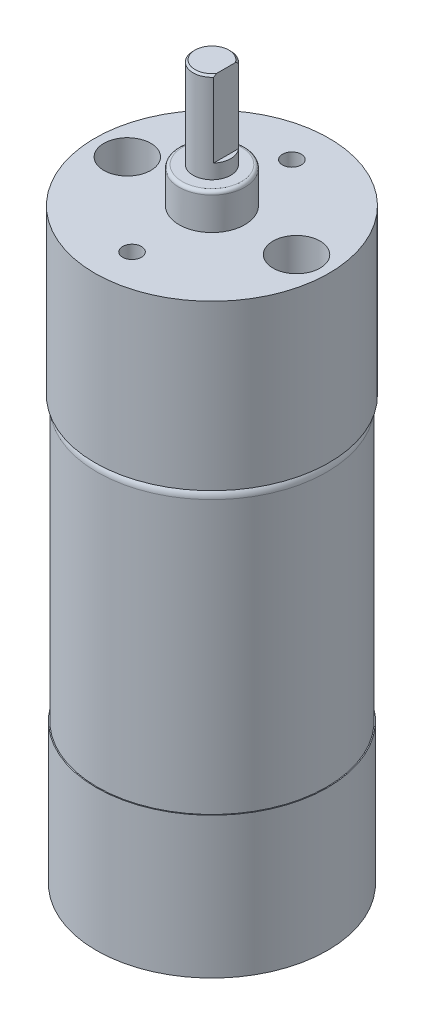
ISO-10303-21;
HEADER;
FILE_DESCRIPTION(('STEP AP214'),'2;1');
FILE_NAME('part.step','',(''),(''),'','','');
FILE_SCHEMA(('AUTOMOTIVE_DESIGN { 1 0 10303 214 1 1 1 1 }'));
ENDSEC;
DATA;
#1=APPLICATION_CONTEXT('core data for automotive mechanical design processes');
#2=APPLICATION_PROTOCOL_DEFINITION('international standard','automotive_design',2000,#1);
#3=PRODUCT_CONTEXT('',#1,'mechanical');
#4=PRODUCT('Part','Part','',(#3));
#5=PRODUCT_RELATED_PRODUCT_CATEGORY('part','',(#4));
#6=PRODUCT_DEFINITION_FORMATION('','',#4);
#7=PRODUCT_DEFINITION_CONTEXT('part definition',#1,'design');
#8=PRODUCT_DEFINITION('design','',#6,#7);
#9=PRODUCT_DEFINITION_SHAPE('','',#8);
#10=(LENGTH_UNIT() NAMED_UNIT(*) SI_UNIT(.MILLI.,.METRE.));
#11=(NAMED_UNIT(*) PLANE_ANGLE_UNIT() SI_UNIT($,.RADIAN.));
#12=(NAMED_UNIT(*) SI_UNIT($,.STERADIAN.) SOLID_ANGLE_UNIT());
#13=UNCERTAINTY_MEASURE_WITH_UNIT(LENGTH_MEASURE(1.E-05),#10,'distance_accuracy_value','');
#14=(GEOMETRIC_REPRESENTATION_CONTEXT(3) GLOBAL_UNCERTAINTY_ASSIGNED_CONTEXT((#13)) GLOBAL_UNIT_ASSIGNED_CONTEXT((#10,
#11,#12)) REPRESENTATION_CONTEXT('',''));
#15=CARTESIAN_POINT('',(0.,0.,0.));
#16=DIRECTION('',(0.,0.,1.));
#17=DIRECTION('',(1.,0.,0.));
#18=AXIS2_PLACEMENT_3D('',#15,#16,#17);
#19=CARTESIAN_POINT('',(0.,45.,0.));
#20=DIRECTION('',(0.,-1.,0.));
#21=DIRECTION('',(0.,0.,-1.));
#22=AXIS2_PLACEMENT_3D('',#19,#20,#21);
#23=CYLINDRICAL_SURFACE('',#22,12.2);
#24=CARTESIAN_POINT('',(0.,44.,0.));
#25=DIRECTION('',(0.,1.,0.));
#26=DIRECTION('',(0.,0.,1.));
#27=AXIS2_PLACEMENT_3D('',#24,#25,#26);
#28=CIRCLE('',#27,12.2);
#29=CARTESIAN_POINT('',(0.,44.,12.2));
#30=VERTEX_POINT('',#29);
#31=EDGE_CURVE('E150',#30,#30,#28,.F.);
#32=ORIENTED_EDGE('',*,*,#31,.T.);
#33=EDGE_LOOP('',(#32));
#34=FACE_BOUND('',#33,.T.);
#35=CARTESIAN_POINT('',(0.,15.,0.));
#36=DIRECTION('',(0.,1.,0.));
#37=DIRECTION('',(0.,0.,1.));
#38=AXIS2_PLACEMENT_3D('',#35,#36,#37);
#39=CIRCLE('',#38,12.2);
#40=CARTESIAN_POINT('',(0.,15.,12.2));
#41=VERTEX_POINT('',#40);
#42=EDGE_CURVE('E142',#41,#41,#39,.T.);
#43=ORIENTED_EDGE('',*,*,#42,.T.);
#44=EDGE_LOOP('',(#43));
#45=FACE_BOUND('',#44,.T.);
#46=ADVANCED_FACE('F49',(#34,#45),#23,.T.);
#47=CARTESIAN_POINT('',(0.,15.,0.));
#48=DIRECTION('',(0.,1.,0.));
#49=DIRECTION('',(0.,0.,1.));
#50=AXIS2_PLACEMENT_3D('',#47,#48,#49);
#51=PLANE('',#50);
#52=ORIENTED_EDGE('',*,*,#42,.F.);
#53=EDGE_LOOP('',(#52));
#54=FACE_BOUND('',#53,.T.);
#55=ADVANCED_FACE('F172',(#54),#51,.F.);
#56=CARTESIAN_POINT('',(0.,44.,0.));
#57=DIRECTION('',(0.,1.,0.));
#58=DIRECTION('',(0.,0.,1.));
#59=AXIS2_PLACEMENT_3D('',#56,#57,#58);
#60=TOROIDAL_SURFACE('',#59,11.2,1.);
#61=ORIENTED_EDGE('',*,*,#31,.F.);
#62=EDGE_LOOP('',(#61));
#63=FACE_BOUND('',#62,.T.);
#64=CARTESIAN_POINT('',(0.,45.,0.));
#65=DIRECTION('',(0.,1.,0.));
#66=DIRECTION('',(0.,0.,1.));
#67=AXIS2_PLACEMENT_3D('',#64,#65,#66);
#68=CIRCLE('',#67,11.2);
#69=CARTESIAN_POINT('',(0.,45.,11.2));
#70=VERTEX_POINT('',#69);
#71=EDGE_CURVE('E147',#70,#70,#68,.T.);
#72=ORIENTED_EDGE('',*,*,#71,.F.);
#73=EDGE_LOOP('',(#72));
#74=FACE_BOUND('',#73,.T.);
#75=ADVANCED_FACE('F178',(#63,#74),#60,.T.);
#76=CARTESIAN_POINT('',(0.,62.45,0.));
#77=DIRECTION('',(0.,-1.,0.));
#78=DIRECTION('',(0.,0.,-1.));
#79=AXIS2_PLACEMENT_3D('',#76,#77,#78);
#80=CYLINDRICAL_SURFACE('',#79,12.45);
#81=CARTESIAN_POINT('',(0.,62.45,0.));
#82=DIRECTION('',(0.,1.,0.));
#83=DIRECTION('',(0.,0.,1.));
#84=AXIS2_PLACEMENT_3D('',#81,#82,#83);
#85=CIRCLE('',#84,12.45);
#86=CARTESIAN_POINT('',(0.,62.45,12.45));
#87=VERTEX_POINT('',#86);
#88=EDGE_CURVE('E139',#87,#87,#85,.T.);
#89=ORIENTED_EDGE('',*,*,#88,.F.);
#90=EDGE_LOOP('',(#89));
#91=FACE_BOUND('',#90,.T.);
#92=CARTESIAN_POINT('',(0.,45.,0.));
#93=DIRECTION('',(0.,1.,0.));
#94=DIRECTION('',(0.,0.,1.));
#95=AXIS2_PLACEMENT_3D('',#92,#93,#94);
#96=CIRCLE('',#95,12.45);
#97=CARTESIAN_POINT('',(0.,45.,12.45));
#98=VERTEX_POINT('',#97);
#99=EDGE_CURVE('E118',#98,#98,#96,.T.);
#100=ORIENTED_EDGE('',*,*,#99,.T.);
#101=EDGE_LOOP('',(#100));
#102=FACE_BOUND('',#101,.T.);
#103=ADVANCED_FACE('F185',(#91,#102),#80,.T.);
#104=CARTESIAN_POINT('',(0.,62.45,0.));
#105=DIRECTION('',(0.,1.,0.));
#106=DIRECTION('',(0.,0.,1.));
#107=AXIS2_PLACEMENT_3D('',#104,#105,#106);
#108=PLANE('',#107);
#109=CARTESIAN_POINT('',(0.,62.45,0.));
#110=DIRECTION('',(0.,1.,0.));
#111=DIRECTION('',(0.,0.,1.));
#112=AXIS2_PLACEMENT_3D('',#109,#110,#111);
#113=CIRCLE('',#112,3.5);
#114=CARTESIAN_POINT('',(0.,62.45,-3.5));
#115=VERTEX_POINT('',#114);
#116=EDGE_CURVE('E111',#115,#115,#113,.T.);
#117=ORIENTED_EDGE('',*,*,#116,.F.);
#118=EDGE_LOOP('',(#117));
#119=FACE_BOUND('',#118,.T.);
#120=CARTESIAN_POINT('',(0.,62.45,-8.5));
#121=DIRECTION('',(0.,1.,0.));
#122=DIRECTION('',(0.,0.,1.));
#123=AXIS2_PLACEMENT_3D('',#120,#121,#122);
#124=CIRCLE('',#123,1.);
#125=CARTESIAN_POINT('',(0.,62.45,-7.5));
#126=VERTEX_POINT('',#125);
#127=EDGE_CURVE('E119',#126,#126,#124,.T.);
#128=ORIENTED_EDGE('',*,*,#127,.F.);
#129=EDGE_LOOP('',(#128));
#130=FACE_BOUND('',#129,.T.);
#131=CARTESIAN_POINT('',(0.,62.45,8.5));
#132=DIRECTION('',(0.,1.,0.));
#133=DIRECTION('',(0.,0.,-1.));
#134=AXIS2_PLACEMENT_3D('',#131,#132,#133);
#135=CIRCLE('',#134,1.);
#136=CARTESIAN_POINT('',(0.,62.45,7.5));
#137=VERTEX_POINT('',#136);
#138=EDGE_CURVE('E125',#137,#137,#135,.T.);
#139=ORIENTED_EDGE('',*,*,#138,.F.);
#140=EDGE_LOOP('',(#139));
#141=FACE_BOUND('',#140,.T.);
#142=CARTESIAN_POINT('',(9.,62.45,0.));
#143=DIRECTION('',(0.,1.,0.));
#144=DIRECTION('',(0.,0.,1.));
#145=AXIS2_PLACEMENT_3D('',#142,#143,#144);
#146=CIRCLE('',#145,2.5);
#147=CARTESIAN_POINT('',(9.,62.45,2.5));
#148=VERTEX_POINT('',#147);
#149=EDGE_CURVE('E131',#148,#148,#146,.T.);
#150=ORIENTED_EDGE('',*,*,#149,.F.);
#151=EDGE_LOOP('',(#150));
#152=FACE_BOUND('',#151,.T.);
#153=CARTESIAN_POINT('',(-9.,62.45,0.));
#154=DIRECTION('',(0.,1.,0.));
#155=DIRECTION('',(0.,0.,-1.));
#156=AXIS2_PLACEMENT_3D('',#153,#154,#155);
#157=CIRCLE('',#156,2.5);
#158=CARTESIAN_POINT('',(-9.,62.45,-2.5));
#159=VERTEX_POINT('',#158);
#160=EDGE_CURVE('E114',#159,#159,#157,.T.);
#161=ORIENTED_EDGE('',*,*,#160,.F.);
#162=EDGE_LOOP('',(#161));
#163=FACE_BOUND('',#162,.T.);
#164=ORIENTED_EDGE('',*,*,#88,.T.);
#165=EDGE_LOOP('',(#164));
#166=FACE_BOUND('',#165,.T.);
#167=ADVANCED_FACE('F210',(#119,#130,#141,#152,#163,#166),#108,.T.);
#168=CARTESIAN_POINT('',(0.,45.,0.));
#169=DIRECTION('',(0.,1.,0.));
#170=DIRECTION('',(0.,0.,1.));
#171=AXIS2_PLACEMENT_3D('',#168,#169,#170);
#172=PLANE('',#171);
#173=ORIENTED_EDGE('',*,*,#71,.T.);
#174=EDGE_LOOP('',(#173));
#175=FACE_BOUND('',#174,.T.);
#176=ORIENTED_EDGE('',*,*,#99,.F.);
#177=EDGE_LOOP('',(#176));
#178=FACE_BOUND('',#177,.T.);
#179=ADVANCED_FACE('F213',(#175,#178),#172,.F.);
#180=CARTESIAN_POINT('',(-9.,54.45,0.));
#181=DIRECTION('',(0.,1.,0.));
#182=DIRECTION('',(0.,0.,1.));
#183=AXIS2_PLACEMENT_3D('',#180,#181,#182);
#184=CYLINDRICAL_SURFACE('',#183,2.5);
#185=CARTESIAN_POINT('',(-9.,54.45,0.));
#186=DIRECTION('',(0.,1.,0.));
#187=DIRECTION('',(0.,0.,-1.));
#188=AXIS2_PLACEMENT_3D('',#185,#186,#187);
#189=CIRCLE('',#188,2.5);
#190=CARTESIAN_POINT('',(-9.,54.45,-2.5));
#191=VERTEX_POINT('',#190);
#192=EDGE_CURVE('E134',#191,#191,#189,.T.);
#193=ORIENTED_EDGE('',*,*,#192,.F.);
#194=EDGE_LOOP('',(#193));
#195=FACE_BOUND('',#194,.T.);
#196=ORIENTED_EDGE('',*,*,#160,.T.);
#197=EDGE_LOOP('',(#196));
#198=FACE_BOUND('',#197,.T.);
#199=ADVANCED_FACE('F230',(#195,#198),#184,.F.);
#200=CARTESIAN_POINT('',(-9.,54.45,0.));
#201=DIRECTION('',(0.,-1.,0.));
#202=DIRECTION('',(0.,0.,-1.));
#203=AXIS2_PLACEMENT_3D('',#200,#201,#202);
#204=PLANE('',#203);
#205=ORIENTED_EDGE('',*,*,#192,.T.);
#206=EDGE_LOOP('',(#205));
#207=FACE_BOUND('',#206,.T.);
#208=ADVANCED_FACE('F236',(#207),#204,.F.);
#209=CARTESIAN_POINT('',(9.,54.45,0.));
#210=DIRECTION('',(0.,1.,0.));
#211=DIRECTION('',(0.,0.,1.));
#212=AXIS2_PLACEMENT_3D('',#209,#210,#211);
#213=CYLINDRICAL_SURFACE('',#212,2.5);
#214=CARTESIAN_POINT('',(9.,54.45,0.));
#215=DIRECTION('',(0.,1.,0.));
#216=DIRECTION('',(0.,0.,1.));
#217=AXIS2_PLACEMENT_3D('',#214,#215,#216);
#218=CIRCLE('',#217,2.5);
#219=CARTESIAN_POINT('',(9.,54.45,2.5));
#220=VERTEX_POINT('',#219);
#221=EDGE_CURVE('E128',#220,#220,#218,.T.);
#222=ORIENTED_EDGE('',*,*,#221,.F.);
#223=EDGE_LOOP('',(#222));
#224=FACE_BOUND('',#223,.T.);
#225=ORIENTED_EDGE('',*,*,#149,.T.);
#226=EDGE_LOOP('',(#225));
#227=FACE_BOUND('',#226,.T.);
#228=ADVANCED_FACE('F242',(#224,#227),#213,.F.);
#229=CARTESIAN_POINT('',(9.,54.45,0.));
#230=DIRECTION('',(0.,1.,0.));
#231=DIRECTION('',(0.,0.,1.));
#232=AXIS2_PLACEMENT_3D('',#229,#230,#231);
#233=PLANE('',#232);
#234=ORIENTED_EDGE('',*,*,#221,.T.);
#235=EDGE_LOOP('',(#234));
#236=FACE_BOUND('',#235,.T.);
#237=ADVANCED_FACE('F246',(#236),#233,.T.);
#238=CARTESIAN_POINT('',(0.,54.45,8.5));
#239=DIRECTION('',(0.,1.,0.));
#240=DIRECTION('',(0.,0.,1.));
#241=AXIS2_PLACEMENT_3D('',#238,#239,#240);
#242=CYLINDRICAL_SURFACE('',#241,1.);
#243=CARTESIAN_POINT('',(0.,54.45,8.5));
#244=DIRECTION('',(0.,1.,0.));
#245=DIRECTION('',(0.,0.,-1.));
#246=AXIS2_PLACEMENT_3D('',#243,#244,#245);
#247=CIRCLE('',#246,1.);
#248=CARTESIAN_POINT('',(0.,54.45,7.5));
#249=VERTEX_POINT('',#248);
#250=EDGE_CURVE('E122',#249,#249,#247,.T.);
#251=ORIENTED_EDGE('',*,*,#250,.F.);
#252=EDGE_LOOP('',(#251));
#253=FACE_BOUND('',#252,.T.);
#254=ORIENTED_EDGE('',*,*,#138,.T.);
#255=EDGE_LOOP('',(#254));
#256=FACE_BOUND('',#255,.T.);
#257=ADVANCED_FACE('F250',(#253,#256),#242,.F.);
#258=CARTESIAN_POINT('',(0.,54.45,8.5));
#259=DIRECTION('',(0.,-1.,0.));
#260=DIRECTION('',(0.,0.,-1.));
#261=AXIS2_PLACEMENT_3D('',#258,#259,#260);
#262=PLANE('',#261);
#263=ORIENTED_EDGE('',*,*,#250,.T.);
#264=EDGE_LOOP('',(#263));
#265=FACE_BOUND('',#264,.T.);
#266=ADVANCED_FACE('F254',(#265),#262,.F.);
#267=CARTESIAN_POINT('',(0.,54.45,-8.5));
#268=DIRECTION('',(0.,1.,0.));
#269=DIRECTION('',(0.,0.,1.));
#270=AXIS2_PLACEMENT_3D('',#267,#268,#269);
#271=CYLINDRICAL_SURFACE('',#270,1.);
#272=CARTESIAN_POINT('',(0.,54.45,-8.5));
#273=DIRECTION('',(0.,1.,0.));
#274=DIRECTION('',(0.,0.,1.));
#275=AXIS2_PLACEMENT_3D('',#272,#273,#274);
#276=CIRCLE('',#275,1.);
#277=CARTESIAN_POINT('',(0.,54.45,-7.5));
#278=VERTEX_POINT('',#277);
#279=EDGE_CURVE('E115',#278,#278,#276,.T.);
#280=ORIENTED_EDGE('',*,*,#279,.F.);
#281=EDGE_LOOP('',(#280));
#282=FACE_BOUND('',#281,.T.);
#283=ORIENTED_EDGE('',*,*,#127,.T.);
#284=EDGE_LOOP('',(#283));
#285=FACE_BOUND('',#284,.T.);
#286=ADVANCED_FACE('F258',(#282,#285),#271,.F.);
#287=CARTESIAN_POINT('',(0.,54.45,-8.5));
#288=DIRECTION('',(0.,1.,0.));
#289=DIRECTION('',(0.,0.,1.));
#290=AXIS2_PLACEMENT_3D('',#287,#288,#289);
#291=PLANE('',#290);
#292=ORIENTED_EDGE('',*,*,#279,.T.);
#293=EDGE_LOOP('',(#292));
#294=FACE_BOUND('',#293,.T.);
#295=ADVANCED_FACE('F206',(#294),#291,.T.);
#296=CARTESIAN_POINT('',(0.,66.25,0.));
#297=DIRECTION('',(0.,-1.,0.));
#298=DIRECTION('',(0.,0.,-1.));
#299=AXIS2_PLACEMENT_3D('',#296,#297,#298);
#300=CYLINDRICAL_SURFACE('',#299,3.5);
#301=CARTESIAN_POINT('',(0.,65.9,0.));
#302=DIRECTION('',(0.,1.,0.));
#303=DIRECTION('',(0.,0.,1.));
#304=AXIS2_PLACEMENT_3D('',#301,#302,#303);
#305=CIRCLE('',#304,3.5);
#306=CARTESIAN_POINT('',(0.,65.9,-3.5));
#307=VERTEX_POINT('',#306);
#308=EDGE_CURVE('E156',#307,#307,#305,.F.);
#309=CARTESIAN_POINT('',(0.,65.9,-3.5));
#310=CARTESIAN_POINT('',(0.,65.8640625,-3.5));
#311=CARTESIAN_POINT('',(0.,65.828125,-3.5));
#312=CARTESIAN_POINT('',(0.,65.75625,-3.5));
#313=CARTESIAN_POINT('',(0.,65.7203125,-3.5));
#314=CARTESIAN_POINT('',(0.,65.6484375,-3.5));
#315=CARTESIAN_POINT('',(0.,65.6125,-3.5));
#316=CARTESIAN_POINT('',(0.,65.540625,-3.5));
#317=CARTESIAN_POINT('',(0.,65.5046875,-3.5));
#318=CARTESIAN_POINT('',(0.,65.4328125,-3.5));
#319=CARTESIAN_POINT('',(0.,65.396875,-3.5));
#320=CARTESIAN_POINT('',(0.,65.325,-3.5));
#321=CARTESIAN_POINT('',(0.,65.2890625,-3.5));
#322=CARTESIAN_POINT('',(0.,65.2171875,-3.5));
#323=CARTESIAN_POINT('',(0.,65.18125,-3.5));
#324=CARTESIAN_POINT('',(0.,65.109375,-3.5));
#325=CARTESIAN_POINT('',(0.,65.0734375,-3.5));
#326=CARTESIAN_POINT('',(0.,65.0015625,-3.5));
#327=CARTESIAN_POINT('',(0.,64.965625,-3.5));
#328=CARTESIAN_POINT('',(0.,64.89375,-3.5));
#329=CARTESIAN_POINT('',(0.,64.8578125,-3.5));
#330=CARTESIAN_POINT('',(0.,64.7859375,-3.5));
#331=CARTESIAN_POINT('',(0.,64.75,-3.5));
#332=CARTESIAN_POINT('',(0.,64.678125,-3.5));
#333=CARTESIAN_POINT('',(0.,64.6421875,-3.5));
#334=CARTESIAN_POINT('',(0.,64.5703125,-3.5));
#335=CARTESIAN_POINT('',(0.,64.534375,-3.5));
#336=CARTESIAN_POINT('',(0.,64.4625,-3.5));
#337=CARTESIAN_POINT('',(0.,64.4265625,-3.5));
#338=CARTESIAN_POINT('',(0.,64.3546875,-3.5));
#339=CARTESIAN_POINT('',(0.,64.31875,-3.5));
#340=CARTESIAN_POINT('',(0.,64.246875,-3.5));
#341=CARTESIAN_POINT('',(0.,64.2109375,-3.5));
#342=CARTESIAN_POINT('',(0.,64.1390625,-3.5));
#343=CARTESIAN_POINT('',(0.,64.103125,-3.5));
#344=CARTESIAN_POINT('',(0.,64.03125,-3.5));
#345=CARTESIAN_POINT('',(0.,63.9953125,-3.5));
#346=CARTESIAN_POINT('',(0.,63.9234375,-3.5));
#347=CARTESIAN_POINT('',(0.,63.8875,-3.5));
#348=CARTESIAN_POINT('',(0.,63.815625,-3.5));
#349=CARTESIAN_POINT('',(0.,63.7796875,-3.5));
#350=CARTESIAN_POINT('',(0.,63.7078125,-3.5));
#351=CARTESIAN_POINT('',(0.,63.671875,-3.5));
#352=CARTESIAN_POINT('',(0.,63.6,-3.5));
#353=CARTESIAN_POINT('',(0.,63.5640625,-3.5));
#354=CARTESIAN_POINT('',(0.,63.4921875,-3.5));
#355=CARTESIAN_POINT('',(0.,63.45625,-3.5));
#356=CARTESIAN_POINT('',(0.,63.384375,-3.5));
#357=CARTESIAN_POINT('',(0.,63.3484375,-3.5));
#358=CARTESIAN_POINT('',(0.,63.2765625,-3.5));
#359=CARTESIAN_POINT('',(0.,63.240625,-3.5));
#360=CARTESIAN_POINT('',(0.,63.16875,-3.5));
#361=CARTESIAN_POINT('',(0.,63.1328125,-3.5));
#362=CARTESIAN_POINT('',(0.,63.0609375,-3.5));
#363=CARTESIAN_POINT('',(0.,63.025,-3.5));
#364=CARTESIAN_POINT('',(0.,62.953125,-3.5));
#365=CARTESIAN_POINT('',(0.,62.9171875,-3.5));
#366=CARTESIAN_POINT('',(0.,62.8453125,-3.5));
#367=CARTESIAN_POINT('',(0.,62.809375,-3.5));
#368=CARTESIAN_POINT('',(0.,62.7375,-3.5));
#369=CARTESIAN_POINT('',(0.,62.7015625,-3.5));
#370=CARTESIAN_POINT('',(0.,62.6296875,-3.5));
#371=CARTESIAN_POINT('',(0.,62.59375,-3.5));
#372=CARTESIAN_POINT('',(0.,62.521875,-3.5));
#373=CARTESIAN_POINT('',(0.,62.4859375,-3.5));
#374=CARTESIAN_POINT('',(0.,62.45,-3.5));
#375=B_SPLINE_CURVE_WITH_KNOTS('',3,(#309,#310,#311,#312,#313,#314,#315,#316,#317,#318,#319,
#320,#321,#322,#323,#324,#325,#326,#327,#328,#329,#330,#331,#332,#333,#334,#335,#336,#337,#338,
#339,#340,#341,#342,#343,#344,#345,#346,#347,#348,#349,#350,#351,#352,#353,#354,#355,#356,#357,
#358,#359,#360,#361,#362,#363,#364,#365,#366,#367,#368,#369,#370,#371,#372,#373,#374),
.UNSPECIFIED.,.F.,.F.,(4,2,2,2,2,2,2,2,2,2,2,2,2,2,2,2,2,2,2,2,2,2,2,2,2,2,2,2,2,2,2,2,4),(0.,
0.107812500000012,0.215625000000011,0.323437500000009,0.431250000000008,0.539062500000007,
0.646875000000005,0.754687500000004,0.862500000000002,0.970312500000001,1.078125,
1.18593750000001,1.29375000000001,1.40156250000001,1.50937500000001,1.61718750000001,1.725,
1.8328125,1.940625,2.0484375,2.15625000000001,2.26406250000001,2.37187500000001,
2.47968750000001,2.58750000000001,2.6953125,2.803125,2.9109375,3.01875,3.1265625,
3.23437500000001,3.34218750000001,3.45),.UNSPECIFIED.);
#376=EDGE_CURVE('BSEAM196',#307,#115,#375,.T.);
#377=ORIENTED_EDGE('',*,*,#308,.T.);
#378=ORIENTED_EDGE('',*,*,#116,.T.);
#379=ORIENTED_EDGE('',*,*,#376,.T.);
#380=ORIENTED_EDGE('',*,*,#376,.F.);
#381=EDGE_LOOP('',(#377,#379,#378,#380));
#382=FACE_BOUND('',#381,.T.);
#383=ADVANCED_FACE('F196',(#382),#300,.T.);
#384=CARTESIAN_POINT('',(0.,66.25,0.));
#385=DIRECTION('',(0.,1.,0.));
#386=DIRECTION('',(0.,0.,1.));
#387=AXIS2_PLACEMENT_3D('',#384,#385,#386);
#388=PLANE('',#387);
#389=CARTESIAN_POINT('',(0.,66.25,0.));
#390=DIRECTION('',(0.,1.,0.));
#391=DIRECTION('',(0.,0.,1.));
#392=AXIS2_PLACEMENT_3D('',#389,#390,#391);
#393=CIRCLE('',#392,2.);
#394=CARTESIAN_POINT('',(0.,66.25,2.));
#395=VERTEX_POINT('',#394);
#396=EDGE_CURVE('E105',#395,#395,#393,.T.);
#397=ORIENTED_EDGE('',*,*,#396,.F.);
#398=EDGE_LOOP('',(#397));
#399=FACE_BOUND('',#398,.T.);
#400=CARTESIAN_POINT('',(0.,66.25,0.));
#401=DIRECTION('',(0.,1.,0.));
#402=DIRECTION('',(0.,0.,1.));
#403=AXIS2_PLACEMENT_3D('',#400,#401,#402);
#404=CIRCLE('',#403,3.15);
#405=CARTESIAN_POINT('',(0.,66.25,3.15));
#406=VERTEX_POINT('',#405);
#407=EDGE_CURVE('E153',#406,#406,#404,.T.);
#408=ORIENTED_EDGE('',*,*,#407,.T.);
#409=EDGE_LOOP('',(#408));
#410=FACE_BOUND('',#409,.T.);
#411=ADVANCED_FACE('F189',(#399,#410),#388,.T.);
#412=CARTESIAN_POINT('',(0.,65.9,0.));
#413=DIRECTION('',(0.,1.,0.));
#414=DIRECTION('',(0.,0.,1.));
#415=AXIS2_PLACEMENT_3D('',#412,#413,#414);
#416=TOROIDAL_SURFACE('',#415,3.15,0.35);
#417=ORIENTED_EDGE('',*,*,#308,.F.);
#418=EDGE_LOOP('',(#417));
#419=FACE_BOUND('',#418,.T.);
#420=ORIENTED_EDGE('',*,*,#407,.F.);
#421=EDGE_LOOP('',(#420));
#422=FACE_BOUND('',#421,.T.);
#423=ADVANCED_FACE('F187',(#419,#422),#416,.T.);
#424=CARTESIAN_POINT('',(0.,75.89,0.));
#425=DIRECTION('',(0.,-1.,0.));
#426=DIRECTION('',(0.,0.,-1.));
#427=AXIS2_PLACEMENT_3D('',#424,#425,#426);
#428=CYLINDRICAL_SURFACE('',#427,2.);
#429=CARTESIAN_POINT('',(0.,75.69,0.));
#430=DIRECTION('',(0.,1.,0.));
#431=DIRECTION('',(0.,0.,1.));
#432=AXIS2_PLACEMENT_3D('',#429,#430,#431);
#433=CIRCLE('',#432,2.);
#434=CARTESIAN_POINT('',(1.5,75.69,1.32287565553229));
#435=VERTEX_POINT('',#434);
#436=CARTESIAN_POINT('',(1.5,75.69,-1.32287565553229));
#437=VERTEX_POINT('',#436);
#438=EDGE_CURVE('E103',#435,#437,#433,.F.);
#439=ORIENTED_EDGE('',*,*,#438,.T.);
#440=DIRECTION('',(0.,1.,0.));
#441=VECTOR('',#440,1.);
#442=CARTESIAN_POINT('',(1.5,67.79,-1.32287565553229));
#443=LINE('',#442,#441);
#444=CARTESIAN_POINT('',(1.5,67.79,-1.32287565553229));
#445=VERTEX_POINT('',#444);
#446=EDGE_CURVE('E95',#445,#437,#443,.T.);
#447=ORIENTED_EDGE('',*,*,#446,.F.);
#448=CARTESIAN_POINT('',(0.,67.79,0.));
#449=DIRECTION('',(0.,1.,0.));
#450=DIRECTION('',(0.,0.,1.));
#451=AXIS2_PLACEMENT_3D('',#448,#449,#450);
#452=CIRCLE('',#451,2.);
#453=CARTESIAN_POINT('',(1.5,67.79,1.32287565553229));
#454=VERTEX_POINT('',#453);
#455=EDGE_CURVE('E87',#454,#445,#452,.T.);
#456=ORIENTED_EDGE('',*,*,#455,.F.);
#457=DIRECTION('',(0.,1.,0.));
#458=VECTOR('',#457,1.);
#459=CARTESIAN_POINT('',(1.5,67.79,1.32287565553229));
#460=LINE('',#459,#458);
#461=EDGE_CURVE('E97',#454,#435,#460,.T.);
#462=ORIENTED_EDGE('',*,*,#461,.T.);
#463=EDGE_LOOP('',(#439,#447,#456,#462));
#464=FACE_BOUND('',#463,.T.);
#465=ORIENTED_EDGE('',*,*,#396,.T.);
#466=EDGE_LOOP('',(#465));
#467=FACE_BOUND('',#466,.T.);
#468=ADVANCED_FACE('F100',(#464,#467),#428,.T.);
#469=CARTESIAN_POINT('',(0.,75.89,0.));
#470=DIRECTION('',(0.,1.,0.));
#471=DIRECTION('',(0.,0.,1.));
#472=AXIS2_PLACEMENT_3D('',#469,#470,#471);
#473=PLANE('',#472);
#474=DIRECTION('',(0.,0.,1.));
#475=VECTOR('',#474,1.);
#476=CARTESIAN_POINT('',(1.5,75.89,-1.32287565553229));
#477=LINE('',#476,#475);
#478=CARTESIAN_POINT('',(1.5,75.89,-0.99498743710665));
#479=VERTEX_POINT('',#478);
#480=CARTESIAN_POINT('',(1.5,75.89,0.99498743710665));
#481=VERTEX_POINT('',#480);
#482=EDGE_CURVE('E70',#479,#481,#477,.T.);
#483=ORIENTED_EDGE('',*,*,#482,.F.);
#484=CARTESIAN_POINT('',(0.,75.89,0.));
#485=DIRECTION('',(0.,1.,0.));
#486=DIRECTION('',(0.,0.,1.));
#487=AXIS2_PLACEMENT_3D('',#484,#485,#486);
#488=CIRCLE('',#487,1.80000000000002);
#489=EDGE_CURVE('E159',#479,#481,#488,.T.);
#490=ORIENTED_EDGE('',*,*,#489,.T.);
#491=EDGE_LOOP('',(#483,#490));
#492=FACE_BOUND('',#491,.T.);
#493=ADVANCED_FACE('F163',(#492),#473,.T.);
#494=CARTESIAN_POINT('',(0.,75.89,0.));
#495=DIRECTION('',(0.,-1.,0.));
#496=DIRECTION('',(0.,0.,-1.));
#497=AXIS2_PLACEMENT_3D('',#494,#495,#496);
#498=CONICAL_SURFACE('',#497,1.80000000000002,0.785398163397392);
#499=CARTESIAN_POINT('',(1.5,75.6895369246303,-1.32357565553229));
#500=CARTESIAN_POINT('',(1.5,75.7107782758531,-1.29146717905741));
#501=CARTESIAN_POINT('',(1.5,75.7317212259219,-1.25916159510774));
#502=CARTESIAN_POINT('',(1.5,75.7729101006793,-1.19409794195792));
#503=CARTESIAN_POINT('',(1.5,75.7931558446417,-1.16133975847509));
#504=CARTESIAN_POINT('',(1.5,75.8528837331661,-1.06198595649875));
#505=CARTESIAN_POINT('',(1.5,75.8911368575497,-0.994638767088757));
#506=CARTESIAN_POINT('',(1.5,75.964195730103,-0.855572957333088));
#507=CARTESIAN_POINT('',(1.5,75.9988696507539,-0.783784230751736));
#508=CARTESIAN_POINT('',(1.5,76.0615147348703,-0.637429300795796));
#509=CARTESIAN_POINT('',(1.5,76.0895003027432,-0.562869473294812));
#510=CARTESIAN_POINT('',(1.5,76.1267123038889,-0.442339158428182));
#511=CARTESIAN_POINT('',(1.5,76.1389117266393,-0.397286909603441));
#512=CARTESIAN_POINT('',(1.5,76.1596785322349,-0.306336564205066));
#513=CARTESIAN_POINT('',(1.5,76.16824580191,-0.260438441322281));
#514=CARTESIAN_POINT('',(1.5,76.1812290278492,-0.168610671979361));
#515=CARTESIAN_POINT('',(1.5,76.1856934105479,-0.122687968512422));
#516=CARTESIAN_POINT('',(1.5,76.1903915960128,-0.0306263749615557));
#517=CARTESIAN_POINT('',(1.5,76.1906257094489,0.0155124989979291));
#518=CARTESIAN_POINT('',(1.5,76.1868477764276,0.107635656636156));
#519=CARTESIAN_POINT('',(1.5,76.1828337828026,0.153619859724052));
#520=CARTESIAN_POINT('',(1.5,76.1707901667106,0.245067993016365));
#521=CARTESIAN_POINT('',(1.5,76.1627585588932,0.290531654616218));
#522=CARTESIAN_POINT('',(1.5,76.1330119091486,0.426738746946162));
#523=CARTESIAN_POINT('',(1.5,76.1057009306217,0.516278186603507));
#524=CARTESIAN_POINT('',(1.5,76.048912729609,0.668432838975498));
#525=CARTESIAN_POINT('',(1.5,76.0218373136847,0.732004636552497));
#526=CARTESIAN_POINT('',(1.5,75.9632530054741,0.857149771517412));
#527=CARTESIAN_POINT('',(1.5,75.9317393820739,0.918720888844574));
#528=CARTESIAN_POINT('',(1.5,75.8663305744151,1.03837494540628));
#529=CARTESIAN_POINT('',(1.5,75.8325241161883,1.09650723024028));
#530=CARTESIAN_POINT('',(1.5,75.7626023553401,1.21114696442699));
#531=CARTESIAN_POINT('',(1.5,75.7264938485888,1.2676585418685));
#532=CARTESIAN_POINT('',(1.5,75.6895369246303,1.32357565553229));
#533=B_SPLINE_CURVE_WITH_KNOTS('',3,(#499,#500,#501,#502,#503,#504,#505,#506,#507,#508,#509,
#510,#511,#512,#513,#514,#515,#516,#517,#518,#519,#520,#521,#522,#523,#524,#525,#526,#527,#528,
#529,#530,#531,#532),.UNSPECIFIED.,.F.,.F.,(4,2,2,2,2,2,2,2,2,2,2,2,2,2,2,2,4),(0.,
0.115492558621436,0.231014832672365,0.463241805357638,0.70219035185488,0.940619552154416,
1.08051942373914,1.22042365398626,1.35865455156634,1.49687529745882,1.63515942583566,
1.77351195651325,2.05324290815003,2.26037446620278,2.46772852099389,2.66941056139547,
2.87052256056454),.UNSPECIFIED.);
#534=EDGE_CURVE('E12',#437,#479,#533,.T.);
#535=ORIENTED_EDGE('',*,*,#534,.F.);
#536=ORIENTED_EDGE('',*,*,#438,.F.);
#537=EDGE_CURVE('E55',#481,#435,#533,.T.);
#538=ORIENTED_EDGE('',*,*,#537,.F.);
#539=ORIENTED_EDGE('',*,*,#489,.F.);
#540=EDGE_LOOP('',(#535,#536,#538,#539));
#541=FACE_BOUND('',#540,.T.);
#542=ADVANCED_FACE('F52',(#541),#498,.T.);
#543=CARTESIAN_POINT('',(1.5,67.79,-1.32287565553229));
#544=DIRECTION('',(-1.,0.,0.));
#545=DIRECTION('',(0.,0.,1.));
#546=AXIS2_PLACEMENT_3D('',#543,#544,#545);
#547=PLANE('',#546);
#548=ORIENTED_EDGE('',*,*,#534,.T.);
#549=ORIENTED_EDGE('',*,*,#482,.T.);
#550=ORIENTED_EDGE('',*,*,#537,.T.);
#551=ORIENTED_EDGE('',*,*,#461,.F.);
#552=DIRECTION('',(0.,0.,1.));
#553=VECTOR('',#552,1.);
#554=CARTESIAN_POINT('',(1.5,67.79,-1.32287565553229));
#555=LINE('',#554,#553);
#556=EDGE_CURVE('E90',#445,#454,#555,.T.);
#557=ORIENTED_EDGE('',*,*,#556,.F.);
#558=ORIENTED_EDGE('',*,*,#446,.T.);
#559=EDGE_LOOP('',(#548,#549,#550,#551,#557,#558));
#560=FACE_BOUND('',#559,.T.);
#561=ADVANCED_FACE('F94',(#560),#547,.F.);
#562=CARTESIAN_POINT('',(0.,67.79,0.));
#563=DIRECTION('',(0.,1.,0.));
#564=DIRECTION('',(0.,0.,1.));
#565=AXIS2_PLACEMENT_3D('',#562,#563,#564);
#566=PLANE('',#565);
#567=ORIENTED_EDGE('',*,*,#455,.T.);
#568=ORIENTED_EDGE('',*,*,#556,.T.);
#569=EDGE_LOOP('',(#567,#568));
#570=FACE_BOUND('',#569,.T.);
#571=ADVANCED_FACE('F89',(#570),#566,.T.);
#572=CLOSED_SHELL('',(#46,#55,#75,#103,#167,#179,#199,#208,#228,#237,#257,#266,#286,#295,#383,
#411,#423,#468,#493,#542,#561,#571));
#573=MANIFOLD_SOLID_BREP('B2',#572);
#574=CARTESIAN_POINT('',(0.,15.,0.));
#575=DIRECTION('',(0.,-1.,0.));
#576=DIRECTION('',(0.,0.,-1.));
#577=AXIS2_PLACEMENT_3D('',#574,#575,#576);
#578=CYLINDRICAL_SURFACE('',#577,12.3);
#579=CARTESIAN_POINT('',(0.,15.,0.));
#580=DIRECTION('',(0.,1.,0.));
#581=DIRECTION('',(0.,0.,1.));
#582=AXIS2_PLACEMENT_3D('',#579,#580,#581);
#583=CIRCLE('',#582,12.3);
#584=CARTESIAN_POINT('',(0.,15.,12.3));
#585=VERTEX_POINT('',#584);
#586=EDGE_CURVE('E48',#585,#585,#583,.T.);
#587=ORIENTED_EDGE('',*,*,#586,.F.);
#588=EDGE_LOOP('',(#587));
#589=FACE_BOUND('',#588,.T.);
#590=CARTESIAN_POINT('',(0.,0.,0.));
#591=DIRECTION('',(0.,1.,0.));
#592=DIRECTION('',(0.,0.,1.));
#593=AXIS2_PLACEMENT_3D('',#590,#591,#592);
#594=CIRCLE('',#593,12.3);
#595=CARTESIAN_POINT('',(0.,0.,12.3));
#596=VERTEX_POINT('',#595);
#597=EDGE_CURVE('E413',#596,#596,#594,.T.);
#598=ORIENTED_EDGE('',*,*,#597,.T.);
#599=EDGE_LOOP('',(#598));
#600=FACE_BOUND('',#599,.T.);
#601=ADVANCED_FACE('F410',(#589,#600),#578,.T.);
#602=CARTESIAN_POINT('',(0.,15.,0.));
#603=DIRECTION('',(0.,1.,0.));
#604=DIRECTION('',(0.,0.,1.));
#605=AXIS2_PLACEMENT_3D('',#602,#603,#604);
#606=PLANE('',#605);
#607=ORIENTED_EDGE('',*,*,#586,.T.);
#608=EDGE_LOOP('',(#607));
#609=FACE_BOUND('',#608,.T.);
#610=ADVANCED_FACE('F425',(#609),#606,.T.);
#611=CARTESIAN_POINT('',(0.,0.,0.));
#612=DIRECTION('',(0.,1.,0.));
#613=DIRECTION('',(0.,0.,1.));
#614=AXIS2_PLACEMENT_3D('',#611,#612,#613);
#615=PLANE('',#614);
#616=ORIENTED_EDGE('',*,*,#597,.F.);
#617=EDGE_LOOP('',(#616));
#618=FACE_BOUND('',#617,.T.);
#619=ADVANCED_FACE('F423',(#618),#615,.F.);
#620=CLOSED_SHELL('',(#601,#610,#619));
#621=MANIFOLD_SOLID_BREP('B6',#620);
#622=ADVANCED_BREP_SHAPE_REPRESENTATION('',(#18,#573,#621),#14);
#623=SHAPE_DEFINITION_REPRESENTATION(#9,#622);
ENDSEC;
END-ISO-10303-21;
